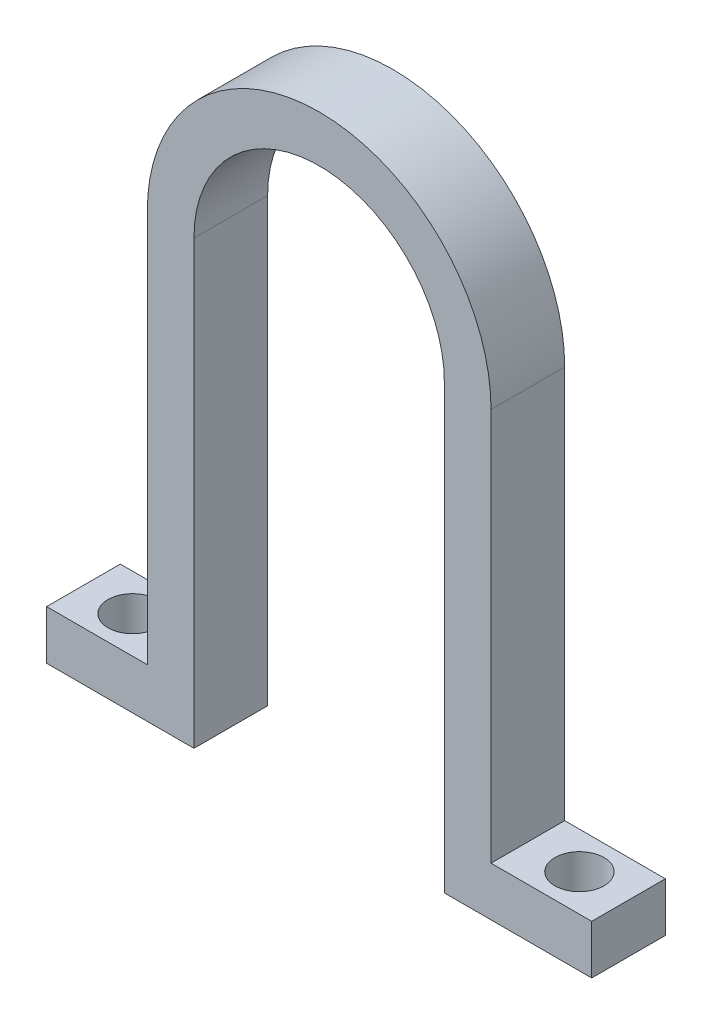
ISO-10303-21;
HEADER;
FILE_DESCRIPTION(('STEP AP214'),'2;1');
FILE_NAME('part.step','',(''),(''),'','','');
FILE_SCHEMA(('AUTOMOTIVE_DESIGN { 1 0 10303 214 1 1 1 1 }'));
ENDSEC;
DATA;
#1=APPLICATION_CONTEXT('core data for automotive mechanical design processes');
#2=APPLICATION_PROTOCOL_DEFINITION('international standard','automotive_design',2000,#1);
#3=PRODUCT_CONTEXT('',#1,'mechanical');
#4=PRODUCT('Part','Part','',(#3));
#5=PRODUCT_RELATED_PRODUCT_CATEGORY('part','',(#4));
#6=PRODUCT_DEFINITION_FORMATION('','',#4);
#7=PRODUCT_DEFINITION_CONTEXT('part definition',#1,'design');
#8=PRODUCT_DEFINITION('design','',#6,#7);
#9=PRODUCT_DEFINITION_SHAPE('','',#8);
#10=(LENGTH_UNIT() NAMED_UNIT(*) SI_UNIT(.MILLI.,.METRE.));
#11=(NAMED_UNIT(*) PLANE_ANGLE_UNIT() SI_UNIT($,.RADIAN.));
#12=(NAMED_UNIT(*) SI_UNIT($,.STERADIAN.) SOLID_ANGLE_UNIT());
#13=UNCERTAINTY_MEASURE_WITH_UNIT(LENGTH_MEASURE(1.E-05),#10,'distance_accuracy_value','');
#14=(GEOMETRIC_REPRESENTATION_CONTEXT(3) GLOBAL_UNCERTAINTY_ASSIGNED_CONTEXT((#13)) GLOBAL_UNIT_ASSIGNED_CONTEXT((#10,
#11,#12)) REPRESENTATION_CONTEXT('',''));
#15=CARTESIAN_POINT('',(0.,0.,0.));
#16=DIRECTION('',(0.,0.,1.));
#17=DIRECTION('',(1.,0.,0.));
#18=AXIS2_PLACEMENT_3D('',#15,#16,#17);
#19=CARTESIAN_POINT('',(25.5,0.,15.));
#20=DIRECTION('',(1.,0.,0.));
#21=DIRECTION('',(0.,1.,0.));
#22=AXIS2_PLACEMENT_3D('',#19,#20,#21);
#23=PLANE('',#22);
#24=DIRECTION('',(0.,-1.,0.));
#25=VECTOR('',#24,1.);
#26=CARTESIAN_POINT('',(25.5,0.,0.));
#27=LINE('',#26,#25);
#28=CARTESIAN_POINT('',(25.5,0.,0.));
#29=VERTEX_POINT('',#28);
#30=CARTESIAN_POINT('',(25.5,-90.,0.));
#31=VERTEX_POINT('',#30);
#32=EDGE_CURVE('E156',#29,#31,#27,.T.);
#33=ORIENTED_EDGE('',*,*,#32,.T.);
#34=DIRECTION('',(0.,0.,-1.));
#35=VECTOR('',#34,1.);
#36=CARTESIAN_POINT('',(25.5,-90.,15.));
#37=LINE('',#36,#35);
#38=CARTESIAN_POINT('',(25.5,-90.,15.));
#39=VERTEX_POINT('',#38);
#40=EDGE_CURVE('E11',#39,#31,#37,.T.);
#41=ORIENTED_EDGE('',*,*,#40,.F.);
#42=DIRECTION('',(0.,-1.,0.));
#43=VECTOR('',#42,1.);
#44=CARTESIAN_POINT('',(25.5,0.,15.));
#45=LINE('',#44,#43);
#46=CARTESIAN_POINT('',(25.5,0.,15.));
#47=VERTEX_POINT('',#46);
#48=EDGE_CURVE('E178',#47,#39,#45,.T.);
#49=ORIENTED_EDGE('',*,*,#48,.F.);
#50=DIRECTION('',(0.,0.,-1.));
#51=VECTOR('',#50,1.);
#52=CARTESIAN_POINT('',(25.5,0.,15.));
#53=LINE('',#52,#51);
#54=EDGE_CURVE('E152',#47,#29,#53,.T.);
#55=ORIENTED_EDGE('',*,*,#54,.T.);
#56=EDGE_LOOP('',(#33,#41,#49,#55));
#57=FACE_BOUND('',#56,.T.);
#58=ADVANCED_FACE('F35',(#57),#23,.F.);
#59=CARTESIAN_POINT('',(25.5,-90.,15.));
#60=DIRECTION('',(0.,1.,0.));
#61=DIRECTION('',(0.,0.,1.));
#62=AXIS2_PLACEMENT_3D('',#59,#60,#61);
#63=PLANE('',#62);
#64=CARTESIAN_POINT('',(45.5,-90.,7.5));
#65=DIRECTION('',(0.,-1.,0.));
#66=DIRECTION('',(0.,0.,1.));
#67=AXIS2_PLACEMENT_3D('',#64,#65,#66);
#68=CIRCLE('',#67,5.);
#69=CARTESIAN_POINT('',(45.5,-90.,12.5));
#70=VERTEX_POINT('',#69);
#71=EDGE_CURVE('E295',#70,#70,#68,.T.);
#72=ORIENTED_EDGE('',*,*,#71,.F.);
#73=EDGE_LOOP('',(#72));
#74=FACE_BOUND('',#73,.T.);
#75=DIRECTION('',(1.,0.,0.));
#76=VECTOR('',#75,1.);
#77=CARTESIAN_POINT('',(25.5,-90.,0.));
#78=LINE('',#77,#76);
#79=CARTESIAN_POINT('',(55.5,-90.,0.));
#80=VERTEX_POINT('',#79);
#81=EDGE_CURVE('E159',#31,#80,#78,.T.);
#82=ORIENTED_EDGE('',*,*,#81,.T.);
#83=DIRECTION('',(0.,0.,-1.));
#84=VECTOR('',#83,1.);
#85=CARTESIAN_POINT('',(55.5,-90.,15.));
#86=LINE('',#85,#84);
#87=CARTESIAN_POINT('',(55.5,-90.,15.));
#88=VERTEX_POINT('',#87);
#89=EDGE_CURVE('E44',#88,#80,#86,.T.);
#90=ORIENTED_EDGE('',*,*,#89,.F.);
#91=DIRECTION('',(1.,0.,0.));
#92=VECTOR('',#91,1.);
#93=CARTESIAN_POINT('',(25.5,-90.,15.));
#94=LINE('',#93,#92);
#95=EDGE_CURVE('E107',#39,#88,#94,.T.);
#96=ORIENTED_EDGE('',*,*,#95,.F.);
#97=ORIENTED_EDGE('',*,*,#40,.T.);
#98=EDGE_LOOP('',(#82,#90,#96,#97));
#99=FACE_BOUND('',#98,.T.);
#100=ADVANCED_FACE('F257',(#74,#99),#63,.F.);
#101=CARTESIAN_POINT('',(55.5,-90.,15.));
#102=DIRECTION('',(-1.,0.,0.));
#103=DIRECTION('',(0.,0.,1.));
#104=AXIS2_PLACEMENT_3D('',#101,#102,#103);
#105=PLANE('',#104);
#106=DIRECTION('',(0.,1.,0.));
#107=VECTOR('',#106,1.);
#108=CARTESIAN_POINT('',(55.5,-90.,0.));
#109=LINE('',#108,#107);
#110=CARTESIAN_POINT('',(55.5,-80.,0.));
#111=VERTEX_POINT('',#110);
#112=EDGE_CURVE('E161',#80,#111,#109,.T.);
#113=ORIENTED_EDGE('',*,*,#112,.T.);
#114=DIRECTION('',(0.,0.,-1.));
#115=VECTOR('',#114,1.);
#116=CARTESIAN_POINT('',(55.5,-80.,15.));
#117=LINE('',#116,#115);
#118=CARTESIAN_POINT('',(55.5,-80.,15.));
#119=VERTEX_POINT('',#118);
#120=EDGE_CURVE('E197',#119,#111,#117,.T.);
#121=ORIENTED_EDGE('',*,*,#120,.F.);
#122=DIRECTION('',(0.,1.,0.));
#123=VECTOR('',#122,1.);
#124=CARTESIAN_POINT('',(55.5,-90.,15.));
#125=LINE('',#124,#123);
#126=EDGE_CURVE('E206',#88,#119,#125,.T.);
#127=ORIENTED_EDGE('',*,*,#126,.F.);
#128=ORIENTED_EDGE('',*,*,#89,.T.);
#129=EDGE_LOOP('',(#113,#121,#127,#128));
#130=FACE_BOUND('',#129,.T.);
#131=ADVANCED_FACE('F204',(#130),#105,.F.);
#132=CARTESIAN_POINT('',(55.5,-80.,15.));
#133=DIRECTION('',(0.,-1.,0.));
#134=DIRECTION('',(0.,0.,-1.));
#135=AXIS2_PLACEMENT_3D('',#132,#133,#134);
#136=PLANE('',#135);
#137=CARTESIAN_POINT('',(45.5,-80.,7.5));
#138=DIRECTION('',(0.,-1.,0.));
#139=DIRECTION('',(0.,0.,-1.));
#140=AXIS2_PLACEMENT_3D('',#137,#138,#139);
#141=CIRCLE('',#140,5.);
#142=CARTESIAN_POINT('',(45.5,-80.,2.5));
#143=VERTEX_POINT('',#142);
#144=EDGE_CURVE('E38',#143,#143,#141,.T.);
#145=ORIENTED_EDGE('',*,*,#144,.T.);
#146=EDGE_LOOP('',(#145));
#147=FACE_BOUND('',#146,.T.);
#148=DIRECTION('',(-1.,0.,0.));
#149=VECTOR('',#148,1.);
#150=CARTESIAN_POINT('',(55.5,-80.,0.));
#151=LINE('',#150,#149);
#152=CARTESIAN_POINT('',(35.,-80.,0.));
#153=VERTEX_POINT('',#152);
#154=EDGE_CURVE('E163',#111,#153,#151,.T.);
#155=ORIENTED_EDGE('',*,*,#154,.T.);
#156=DIRECTION('',(0.,0.,-1.));
#157=VECTOR('',#156,1.);
#158=CARTESIAN_POINT('',(35.,-80.,15.));
#159=LINE('',#158,#157);
#160=CARTESIAN_POINT('',(35.,-80.,15.));
#161=VERTEX_POINT('',#160);
#162=EDGE_CURVE('E194',#161,#153,#159,.T.);
#163=ORIENTED_EDGE('',*,*,#162,.F.);
#164=DIRECTION('',(-1.,0.,0.));
#165=VECTOR('',#164,1.);
#166=CARTESIAN_POINT('',(55.5,-80.,15.));
#167=LINE('',#166,#165);
#168=EDGE_CURVE('E224',#119,#161,#167,.T.);
#169=ORIENTED_EDGE('',*,*,#168,.F.);
#170=ORIENTED_EDGE('',*,*,#120,.T.);
#171=EDGE_LOOP('',(#155,#163,#169,#170));
#172=FACE_BOUND('',#171,.T.);
#173=ADVANCED_FACE('F215',(#147,#172),#136,.F.);
#174=CARTESIAN_POINT('',(35.,0.,15.));
#175=DIRECTION('',(-1.,0.,0.));
#176=DIRECTION('',(0.,-1.,0.));
#177=AXIS2_PLACEMENT_3D('',#174,#175,#176);
#178=PLANE('',#177);
#179=DIRECTION('',(0.,1.,0.));
#180=VECTOR('',#179,1.);
#181=CARTESIAN_POINT('',(35.,0.,0.));
#182=LINE('',#181,#180);
#183=CARTESIAN_POINT('',(35.,0.,0.));
#184=VERTEX_POINT('',#183);
#185=EDGE_CURVE('E165',#153,#184,#182,.T.);
#186=ORIENTED_EDGE('',*,*,#185,.T.);
#187=DIRECTION('',(0.,0.,-1.));
#188=VECTOR('',#187,1.);
#189=CARTESIAN_POINT('',(35.,0.,15.));
#190=LINE('',#189,#188);
#191=CARTESIAN_POINT('',(35.,0.,15.));
#192=VERTEX_POINT('',#191);
#193=EDGE_CURVE('E191',#192,#184,#190,.T.);
#194=ORIENTED_EDGE('',*,*,#193,.F.);
#195=DIRECTION('',(0.,1.,0.));
#196=VECTOR('',#195,1.);
#197=CARTESIAN_POINT('',(35.,0.,15.));
#198=LINE('',#197,#196);
#199=EDGE_CURVE('E221',#161,#192,#198,.T.);
#200=ORIENTED_EDGE('',*,*,#199,.F.);
#201=ORIENTED_EDGE('',*,*,#162,.T.);
#202=EDGE_LOOP('',(#186,#194,#200,#201));
#203=FACE_BOUND('',#202,.T.);
#204=ADVANCED_FACE('F219',(#203),#178,.F.);
#205=CARTESIAN_POINT('',(0.,0.,15.));
#206=DIRECTION('',(0.,0.,-1.));
#207=DIRECTION('',(-1.,0.,0.));
#208=AXIS2_PLACEMENT_3D('',#205,#206,#207);
#209=CYLINDRICAL_SURFACE('',#208,35.);
#210=CARTESIAN_POINT('',(0.,0.,0.));
#211=DIRECTION('',(0.,0.,1.));
#212=DIRECTION('',(1.,0.,0.));
#213=AXIS2_PLACEMENT_3D('',#210,#211,#212);
#214=CIRCLE('',#213,35.);
#215=CARTESIAN_POINT('',(-35.,0.,0.));
#216=VERTEX_POINT('',#215);
#217=EDGE_CURVE('E167',#184,#216,#214,.T.);
#218=ORIENTED_EDGE('',*,*,#217,.T.);
#219=DIRECTION('',(0.,0.,-1.));
#220=VECTOR('',#219,1.);
#221=CARTESIAN_POINT('',(-35.,0.,15.));
#222=LINE('',#221,#220);
#223=CARTESIAN_POINT('',(-35.,0.,15.));
#224=VERTEX_POINT('',#223);
#225=EDGE_CURVE('E188',#224,#216,#222,.T.);
#226=ORIENTED_EDGE('',*,*,#225,.F.);
#227=CARTESIAN_POINT('',(0.,0.,15.));
#228=DIRECTION('',(0.,0.,1.));
#229=DIRECTION('',(1.,0.,0.));
#230=AXIS2_PLACEMENT_3D('',#227,#228,#229);
#231=CIRCLE('',#230,35.);
#232=EDGE_CURVE('E223',#192,#224,#231,.T.);
#233=ORIENTED_EDGE('',*,*,#232,.F.);
#234=ORIENTED_EDGE('',*,*,#193,.T.);
#235=EDGE_LOOP('',(#218,#226,#233,#234));
#236=FACE_BOUND('',#235,.T.);
#237=ADVANCED_FACE('F273',(#236),#209,.T.);
#238=CARTESIAN_POINT('',(-35.,0.,15.));
#239=DIRECTION('',(1.,0.,0.));
#240=DIRECTION('',(0.,0.,-1.));
#241=AXIS2_PLACEMENT_3D('',#238,#239,#240);
#242=PLANE('',#241);
#243=DIRECTION('',(0.,-1.,0.));
#244=VECTOR('',#243,1.);
#245=CARTESIAN_POINT('',(-35.,0.,0.));
#246=LINE('',#245,#244);
#247=CARTESIAN_POINT('',(-35.,-80.,0.));
#248=VERTEX_POINT('',#247);
#249=EDGE_CURVE('E169',#216,#248,#246,.T.);
#250=ORIENTED_EDGE('',*,*,#249,.T.);
#251=DIRECTION('',(0.,0.,-1.));
#252=VECTOR('',#251,1.);
#253=CARTESIAN_POINT('',(-35.,-80.,15.));
#254=LINE('',#253,#252);
#255=CARTESIAN_POINT('',(-35.,-80.,15.));
#256=VERTEX_POINT('',#255);
#257=EDGE_CURVE('E185',#256,#248,#254,.T.);
#258=ORIENTED_EDGE('',*,*,#257,.F.);
#259=DIRECTION('',(0.,-1.,0.));
#260=VECTOR('',#259,1.);
#261=CARTESIAN_POINT('',(-35.,0.,15.));
#262=LINE('',#261,#260);
#263=EDGE_CURVE('E226',#224,#256,#262,.T.);
#264=ORIENTED_EDGE('',*,*,#263,.F.);
#265=ORIENTED_EDGE('',*,*,#225,.T.);
#266=EDGE_LOOP('',(#250,#258,#264,#265));
#267=FACE_BOUND('',#266,.T.);
#268=ADVANCED_FACE('F276',(#267),#242,.F.);
#269=CARTESIAN_POINT('',(-55.5,-80.,15.));
#270=DIRECTION('',(0.,-1.,0.));
#271=DIRECTION('',(0.,0.,-1.));
#272=AXIS2_PLACEMENT_3D('',#269,#270,#271);
#273=PLANE('',#272);
#274=CARTESIAN_POINT('',(-45.5,-80.,7.5));
#275=DIRECTION('',(0.,-1.,0.));
#276=DIRECTION('',(0.,0.,-1.));
#277=AXIS2_PLACEMENT_3D('',#274,#275,#276);
#278=CIRCLE('',#277,5.);
#279=CARTESIAN_POINT('',(-45.5,-80.,2.5));
#280=VERTEX_POINT('',#279);
#281=EDGE_CURVE('E294',#280,#280,#278,.T.);
#282=ORIENTED_EDGE('',*,*,#281,.T.);
#283=EDGE_LOOP('',(#282));
#284=FACE_BOUND('',#283,.T.);
#285=DIRECTION('',(-1.,0.,0.));
#286=VECTOR('',#285,1.);
#287=CARTESIAN_POINT('',(-55.5,-80.,0.));
#288=LINE('',#287,#286);
#289=CARTESIAN_POINT('',(-55.5,-80.,0.));
#290=VERTEX_POINT('',#289);
#291=EDGE_CURVE('E171',#248,#290,#288,.T.);
#292=ORIENTED_EDGE('',*,*,#291,.T.);
#293=DIRECTION('',(0.,0.,-1.));
#294=VECTOR('',#293,1.);
#295=CARTESIAN_POINT('',(-55.5,-80.,15.));
#296=LINE('',#295,#294);
#297=CARTESIAN_POINT('',(-55.5,-80.,15.));
#298=VERTEX_POINT('',#297);
#299=EDGE_CURVE('E182',#298,#290,#296,.T.);
#300=ORIENTED_EDGE('',*,*,#299,.F.);
#301=DIRECTION('',(-1.,0.,0.));
#302=VECTOR('',#301,1.);
#303=CARTESIAN_POINT('',(-55.5,-80.,15.));
#304=LINE('',#303,#302);
#305=EDGE_CURVE('E232',#256,#298,#304,.T.);
#306=ORIENTED_EDGE('',*,*,#305,.F.);
#307=ORIENTED_EDGE('',*,*,#257,.T.);
#308=EDGE_LOOP('',(#292,#300,#306,#307));
#309=FACE_BOUND('',#308,.T.);
#310=ADVANCED_FACE('F238',(#284,#309),#273,.F.);
#311=CARTESIAN_POINT('',(-55.5,-90.,15.));
#312=DIRECTION('',(1.,0.,0.));
#313=DIRECTION('',(0.,1.,0.));
#314=AXIS2_PLACEMENT_3D('',#311,#312,#313);
#315=PLANE('',#314);
#316=DIRECTION('',(0.,-1.,0.));
#317=VECTOR('',#316,1.);
#318=CARTESIAN_POINT('',(-55.5,-90.,0.));
#319=LINE('',#318,#317);
#320=CARTESIAN_POINT('',(-55.5,-90.,0.));
#321=VERTEX_POINT('',#320);
#322=EDGE_CURVE('E173',#290,#321,#319,.T.);
#323=ORIENTED_EDGE('',*,*,#322,.T.);
#324=DIRECTION('',(0.,0.,-1.));
#325=VECTOR('',#324,1.);
#326=CARTESIAN_POINT('',(-55.5,-90.,15.));
#327=LINE('',#326,#325);
#328=CARTESIAN_POINT('',(-55.5,-90.,15.));
#329=VERTEX_POINT('',#328);
#330=EDGE_CURVE('E147',#329,#321,#327,.T.);
#331=ORIENTED_EDGE('',*,*,#330,.F.);
#332=DIRECTION('',(0.,-1.,0.));
#333=VECTOR('',#332,1.);
#334=CARTESIAN_POINT('',(-55.5,-90.,15.));
#335=LINE('',#334,#333);
#336=EDGE_CURVE('E138',#298,#329,#335,.T.);
#337=ORIENTED_EDGE('',*,*,#336,.F.);
#338=ORIENTED_EDGE('',*,*,#299,.T.);
#339=EDGE_LOOP('',(#323,#331,#337,#338));
#340=FACE_BOUND('',#339,.T.);
#341=ADVANCED_FACE('F242',(#340),#315,.F.);
#342=CARTESIAN_POINT('',(-25.5,-90.,15.));
#343=DIRECTION('',(0.,1.,0.));
#344=DIRECTION('',(-1.,0.,0.));
#345=AXIS2_PLACEMENT_3D('',#342,#343,#344);
#346=PLANE('',#345);
#347=CARTESIAN_POINT('',(-45.5,-90.,7.5));
#348=DIRECTION('',(0.,-1.,0.));
#349=DIRECTION('',(0.,0.,-1.));
#350=AXIS2_PLACEMENT_3D('',#347,#348,#349);
#351=CIRCLE('',#350,5.);
#352=CARTESIAN_POINT('',(-45.5,-90.,2.5));
#353=VERTEX_POINT('',#352);
#354=EDGE_CURVE('E292',#353,#353,#351,.T.);
#355=ORIENTED_EDGE('',*,*,#354,.F.);
#356=EDGE_LOOP('',(#355));
#357=FACE_BOUND('',#356,.T.);
#358=DIRECTION('',(1.,0.,0.));
#359=VECTOR('',#358,1.);
#360=CARTESIAN_POINT('',(-25.5,-90.,0.));
#361=LINE('',#360,#359);
#362=CARTESIAN_POINT('',(-25.5,-90.,0.));
#363=VERTEX_POINT('',#362);
#364=EDGE_CURVE('E146',#321,#363,#361,.T.);
#365=ORIENTED_EDGE('',*,*,#364,.T.);
#366=DIRECTION('',(0.,0.,-1.));
#367=VECTOR('',#366,1.);
#368=CARTESIAN_POINT('',(-25.5,-90.,15.));
#369=LINE('',#368,#367);
#370=CARTESIAN_POINT('',(-25.5,-90.,15.));
#371=VERTEX_POINT('',#370);
#372=EDGE_CURVE('E143',#371,#363,#369,.T.);
#373=ORIENTED_EDGE('',*,*,#372,.F.);
#374=DIRECTION('',(1.,0.,0.));
#375=VECTOR('',#374,1.);
#376=CARTESIAN_POINT('',(-25.5,-90.,15.));
#377=LINE('',#376,#375);
#378=EDGE_CURVE('E132',#329,#371,#377,.T.);
#379=ORIENTED_EDGE('',*,*,#378,.F.);
#380=ORIENTED_EDGE('',*,*,#330,.T.);
#381=EDGE_LOOP('',(#365,#373,#379,#380));
#382=FACE_BOUND('',#381,.T.);
#383=ADVANCED_FACE('F144',(#357,#382),#346,.F.);
#384=CARTESIAN_POINT('',(-25.5,0.,15.));
#385=DIRECTION('',(-1.,0.,0.));
#386=DIRECTION('',(0.,-1.,0.));
#387=AXIS2_PLACEMENT_3D('',#384,#385,#386);
#388=PLANE('',#387);
#389=DIRECTION('',(0.,1.,0.));
#390=VECTOR('',#389,1.);
#391=CARTESIAN_POINT('',(-25.5,0.,0.));
#392=LINE('',#391,#390);
#393=CARTESIAN_POINT('',(-25.5,0.,0.));
#394=VERTEX_POINT('',#393);
#395=EDGE_CURVE('E93',#363,#394,#392,.T.);
#396=ORIENTED_EDGE('',*,*,#395,.T.);
#397=DIRECTION('',(0.,0.,-1.));
#398=VECTOR('',#397,1.);
#399=CARTESIAN_POINT('',(-25.5,0.,15.));
#400=LINE('',#399,#398);
#401=CARTESIAN_POINT('',(-25.5,0.,15.));
#402=VERTEX_POINT('',#401);
#403=EDGE_CURVE('E148',#402,#394,#400,.T.);
#404=ORIENTED_EDGE('',*,*,#403,.F.);
#405=DIRECTION('',(0.,1.,0.));
#406=VECTOR('',#405,1.);
#407=CARTESIAN_POINT('',(-25.5,0.,15.));
#408=LINE('',#407,#406);
#409=EDGE_CURVE('E136',#371,#402,#408,.T.);
#410=ORIENTED_EDGE('',*,*,#409,.F.);
#411=ORIENTED_EDGE('',*,*,#372,.T.);
#412=EDGE_LOOP('',(#396,#404,#410,#411));
#413=FACE_BOUND('',#412,.T.);
#414=ADVANCED_FACE('F150',(#413),#388,.F.);
#415=CARTESIAN_POINT('',(0.,0.,15.));
#416=DIRECTION('',(0.,0.,-1.));
#417=DIRECTION('',(-1.,0.,0.));
#418=AXIS2_PLACEMENT_3D('',#415,#416,#417);
#419=CYLINDRICAL_SURFACE('',#418,25.5);
#420=CARTESIAN_POINT('',(0.,0.,0.));
#421=DIRECTION('',(0.,0.,-1.));
#422=DIRECTION('',(1.,0.,0.));
#423=AXIS2_PLACEMENT_3D('',#420,#421,#422);
#424=CIRCLE('',#423,25.5);
#425=EDGE_CURVE('E99',#394,#29,#424,.T.);
#426=ORIENTED_EDGE('',*,*,#425,.T.);
#427=ORIENTED_EDGE('',*,*,#54,.F.);
#428=CARTESIAN_POINT('',(0.,0.,15.));
#429=DIRECTION('',(0.,0.,-1.));
#430=DIRECTION('',(1.,0.,0.));
#431=AXIS2_PLACEMENT_3D('',#428,#429,#430);
#432=CIRCLE('',#431,25.5);
#433=EDGE_CURVE('E52',#402,#47,#432,.T.);
#434=ORIENTED_EDGE('',*,*,#433,.F.);
#435=ORIENTED_EDGE('',*,*,#403,.T.);
#436=EDGE_LOOP('',(#426,#427,#434,#435));
#437=FACE_BOUND('',#436,.T.);
#438=ADVANCED_FACE('F246',(#437),#419,.F.);
#439=CARTESIAN_POINT('',(0.,0.,15.));
#440=DIRECTION('',(0.,0.,1.));
#441=DIRECTION('',(1.,0.,0.));
#442=AXIS2_PLACEMENT_3D('',#439,#440,#441);
#443=PLANE('',#442);
#444=ORIENTED_EDGE('',*,*,#48,.T.);
#445=ORIENTED_EDGE('',*,*,#95,.T.);
#446=ORIENTED_EDGE('',*,*,#126,.T.);
#447=ORIENTED_EDGE('',*,*,#168,.T.);
#448=ORIENTED_EDGE('',*,*,#199,.T.);
#449=ORIENTED_EDGE('',*,*,#232,.T.);
#450=ORIENTED_EDGE('',*,*,#263,.T.);
#451=ORIENTED_EDGE('',*,*,#305,.T.);
#452=ORIENTED_EDGE('',*,*,#336,.T.);
#453=ORIENTED_EDGE('',*,*,#378,.T.);
#454=ORIENTED_EDGE('',*,*,#409,.T.);
#455=ORIENTED_EDGE('',*,*,#433,.T.);
#456=EDGE_LOOP('',(#444,#445,#446,#447,#448,#449,#450,#451,#452,#453,#454,#455));
#457=FACE_BOUND('',#456,.T.);
#458=ADVANCED_FACE('F134',(#457),#443,.T.);
#459=CARTESIAN_POINT('',(0.,0.,0.));
#460=DIRECTION('',(0.,0.,1.));
#461=DIRECTION('',(1.,0.,0.));
#462=AXIS2_PLACEMENT_3D('',#459,#460,#461);
#463=PLANE('',#462);
#464=ORIENTED_EDGE('',*,*,#32,.F.);
#465=ORIENTED_EDGE('',*,*,#425,.F.);
#466=ORIENTED_EDGE('',*,*,#395,.F.);
#467=ORIENTED_EDGE('',*,*,#364,.F.);
#468=ORIENTED_EDGE('',*,*,#322,.F.);
#469=ORIENTED_EDGE('',*,*,#291,.F.);
#470=ORIENTED_EDGE('',*,*,#249,.F.);
#471=ORIENTED_EDGE('',*,*,#217,.F.);
#472=ORIENTED_EDGE('',*,*,#185,.F.);
#473=ORIENTED_EDGE('',*,*,#154,.F.);
#474=ORIENTED_EDGE('',*,*,#112,.F.);
#475=ORIENTED_EDGE('',*,*,#81,.F.);
#476=EDGE_LOOP('',(#464,#465,#466,#467,#468,#469,#470,#471,#472,#473,#474,#475));
#477=FACE_BOUND('',#476,.T.);
#478=ADVANCED_FACE('F210',(#477),#463,.F.);
#479=CARTESIAN_POINT('',(-45.5,35.,7.5));
#480=DIRECTION('',(0.,-1.,0.));
#481=DIRECTION('',(0.,0.,-1.));
#482=AXIS2_PLACEMENT_3D('',#479,#480,#481);
#483=CYLINDRICAL_SURFACE('',#482,5.);
#484=ORIENTED_EDGE('',*,*,#354,.T.);
#485=EDGE_LOOP('',(#484));
#486=FACE_BOUND('',#485,.T.);
#487=ORIENTED_EDGE('',*,*,#281,.F.);
#488=EDGE_LOOP('',(#487));
#489=FACE_BOUND('',#488,.T.);
#490=ADVANCED_FACE('F307',(#486,#489),#483,.F.);
#491=CARTESIAN_POINT('',(45.5,35.,7.5));
#492=DIRECTION('',(0.,-1.,0.));
#493=DIRECTION('',(0.,0.,-1.));
#494=AXIS2_PLACEMENT_3D('',#491,#492,#493);
#495=CYLINDRICAL_SURFACE('',#494,5.);
#496=ORIENTED_EDGE('',*,*,#71,.T.);
#497=EDGE_LOOP('',(#496));
#498=FACE_BOUND('',#497,.T.);
#499=ORIENTED_EDGE('',*,*,#144,.F.);
#500=EDGE_LOOP('',(#499));
#501=FACE_BOUND('',#500,.T.);
#502=ADVANCED_FACE('F304',(#498,#501),#495,.F.);
#503=CLOSED_SHELL('',(#58,#100,#131,#173,#204,#237,#268,#310,#341,#383,#414,#438,#458,#478,#490,#502));
#504=MANIFOLD_SOLID_BREP('B2',#503);
#505=ADVANCED_BREP_SHAPE_REPRESENTATION('',(#18,#504),#14);
#506=SHAPE_DEFINITION_REPRESENTATION(#9,#505);
ENDSEC;
END-ISO-10303-21;
